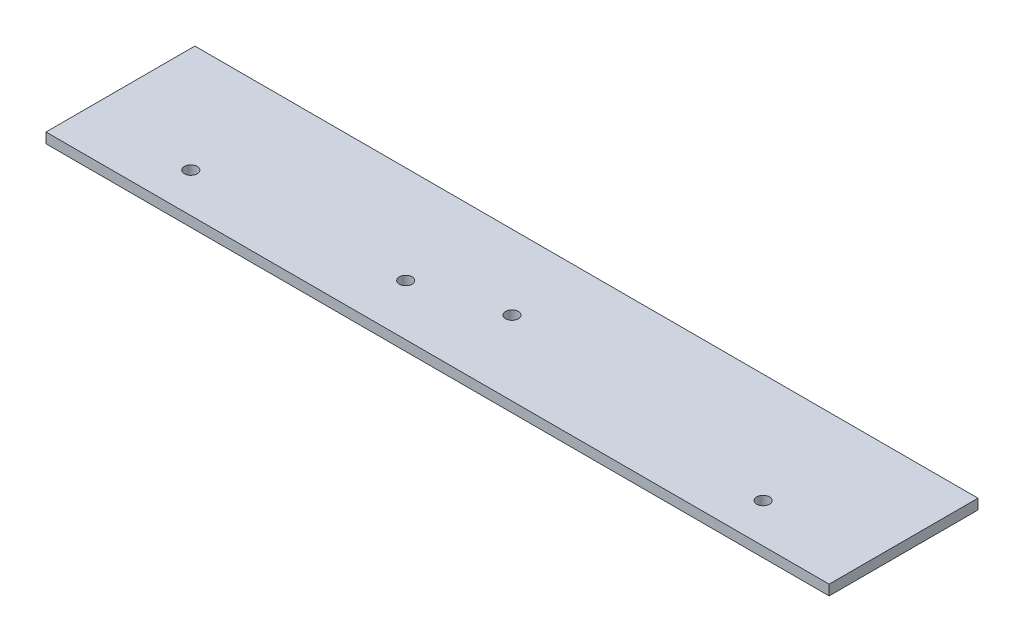
ISO-10303-21;
HEADER;
FILE_DESCRIPTION(('STEP AP214'),'2;1');
FILE_NAME('part.step','',(''),(''),'','','');
FILE_SCHEMA(('AUTOMOTIVE_DESIGN { 1 0 10303 214 1 1 1 1 }'));
ENDSEC;
DATA;
#1=APPLICATION_CONTEXT('core data for automotive mechanical design processes');
#2=APPLICATION_PROTOCOL_DEFINITION('international standard','automotive_design',2000,#1);
#3=PRODUCT_CONTEXT('',#1,'mechanical');
#4=PRODUCT('Part','Part','',(#3));
#5=PRODUCT_RELATED_PRODUCT_CATEGORY('part','',(#4));
#6=PRODUCT_DEFINITION_FORMATION('','',#4);
#7=PRODUCT_DEFINITION_CONTEXT('part definition',#1,'design');
#8=PRODUCT_DEFINITION('design','',#6,#7);
#9=PRODUCT_DEFINITION_SHAPE('','',#8);
#10=(LENGTH_UNIT() NAMED_UNIT(*) SI_UNIT(.MILLI.,.METRE.));
#11=(NAMED_UNIT(*) PLANE_ANGLE_UNIT() SI_UNIT($,.RADIAN.));
#12=(NAMED_UNIT(*) SI_UNIT($,.STERADIAN.) SOLID_ANGLE_UNIT());
#13=UNCERTAINTY_MEASURE_WITH_UNIT(LENGTH_MEASURE(1.E-05),#10,'distance_accuracy_value','');
#14=(GEOMETRIC_REPRESENTATION_CONTEXT(3) GLOBAL_UNCERTAINTY_ASSIGNED_CONTEXT((#13)) GLOBAL_UNIT_ASSIGNED_CONTEXT((#10,
#11,#12)) REPRESENTATION_CONTEXT('',''));
#15=CARTESIAN_POINT('',(0.,0.,0.));
#16=DIRECTION('',(0.,0.,1.));
#17=DIRECTION('',(1.,0.,0.));
#18=AXIS2_PLACEMENT_3D('',#15,#16,#17);
#19=CARTESIAN_POINT('',(0.,1.27,0.));
#20=DIRECTION('',(0.,-1.,0.));
#21=DIRECTION('',(0.,0.,-1.));
#22=AXIS2_PLACEMENT_3D('',#19,#20,#21);
#23=PLANE('',#22);
#24=CARTESIAN_POINT('',(0.,1.27,0.));
#25=DIRECTION('',(0.,1.,0.));
#26=DIRECTION('',(0.,0.,1.));
#27=AXIS2_PLACEMENT_3D('',#24,#25,#26);
#28=CIRCLE('',#27,1.5875);
#29=CARTESIAN_POINT('',(0.,1.27,1.5875));
#30=VERTEX_POINT('',#29);
#31=EDGE_CURVE('E121',#30,#30,#28,.T.);
#32=ORIENTED_EDGE('',*,*,#31,.F.);
#33=EDGE_LOOP('',(#32));
#34=FACE_BOUND('',#33,.T.);
#35=CARTESIAN_POINT('',(-71.,1.27,8.69499999999999));
#36=DIRECTION('',(0.,1.,0.));
#37=DIRECTION('',(0.,0.,1.));
#38=AXIS2_PLACEMENT_3D('',#35,#36,#37);
#39=CIRCLE('',#38,1.58750000000007);
#40=CARTESIAN_POINT('',(-71.,1.27,10.2825000000001));
#41=VERTEX_POINT('',#40);
#42=EDGE_CURVE('E100',#41,#41,#39,.T.);
#43=ORIENTED_EDGE('',*,*,#42,.F.);
#44=EDGE_LOOP('',(#43));
#45=FACE_BOUND('',#44,.T.);
#46=DIRECTION('',(0.,0.,-1.));
#47=VECTOR('',#46,1.);
#48=CARTESIAN_POINT('',(97.1504374582062,1.27,18.4655866878851));
#49=LINE('',#48,#47);
#50=CARTESIAN_POINT('',(97.1504374582062,1.27,18.4655866878851));
#51=VERTEX_POINT('',#50);
#52=CARTESIAN_POINT('',(97.1504374582062,1.27,-18.4655866878852));
#53=VERTEX_POINT('',#52);
#54=EDGE_CURVE('E85',#51,#53,#49,.T.);
#55=ORIENTED_EDGE('',*,*,#54,.T.);
#56=DIRECTION('',(-1.,0.,0.));
#57=VECTOR('',#56,1.);
#58=CARTESIAN_POINT('',(-97.1504374582062,1.27,-18.4655866878852));
#59=LINE('',#58,#57);
#60=CARTESIAN_POINT('',(-97.1504374582062,1.27,-18.4655866878852));
#61=VERTEX_POINT('',#60);
#62=EDGE_CURVE('E80',#53,#61,#59,.T.);
#63=ORIENTED_EDGE('',*,*,#62,.T.);
#64=DIRECTION('',(0.,0.,1.));
#65=VECTOR('',#64,1.);
#66=CARTESIAN_POINT('',(-97.1504374582062,1.27,18.4655866878851));
#67=LINE('',#66,#65);
#68=CARTESIAN_POINT('',(-97.1504374582062,1.27,18.4655866878851));
#69=VERTEX_POINT('',#68);
#70=EDGE_CURVE('E83',#61,#69,#67,.T.);
#71=ORIENTED_EDGE('',*,*,#70,.T.);
#72=DIRECTION('',(1.,0.,0.));
#73=VECTOR('',#72,1.);
#74=CARTESIAN_POINT('',(-97.1504374582062,1.27,18.4655866878851));
#75=LINE('',#74,#73);
#76=EDGE_CURVE('E50',#69,#51,#75,.T.);
#77=ORIENTED_EDGE('',*,*,#76,.T.);
#78=EDGE_LOOP('',(#55,#63,#71,#77));
#79=FACE_BOUND('',#78,.T.);
#80=CARTESIAN_POINT('',(71.,1.27,8.69499999999999));
#81=DIRECTION('',(0.,1.,0.));
#82=DIRECTION('',(0.,0.,1.));
#83=AXIS2_PLACEMENT_3D('',#80,#81,#82);
#84=CIRCLE('',#83,1.5875);
#85=CARTESIAN_POINT('',(71.,1.27,10.2825));
#86=VERTEX_POINT('',#85);
#87=EDGE_CURVE('E115',#86,#86,#84,.T.);
#88=ORIENTED_EDGE('',*,*,#87,.F.);
#89=EDGE_LOOP('',(#88));
#90=FACE_BOUND('',#89,.T.);
#91=CARTESIAN_POINT('',(-20.62,1.27,5.74999999999999));
#92=DIRECTION('',(0.,1.,0.));
#93=DIRECTION('',(0.,0.,1.));
#94=AXIS2_PLACEMENT_3D('',#91,#92,#93);
#95=CIRCLE('',#94,1.5875);
#96=CARTESIAN_POINT('',(-20.62,1.27,7.33749999999999));
#97=VERTEX_POINT('',#96);
#98=EDGE_CURVE('E127',#97,#97,#95,.T.);
#99=ORIENTED_EDGE('',*,*,#98,.F.);
#100=EDGE_LOOP('',(#99));
#101=FACE_BOUND('',#100,.T.);
#102=ADVANCED_FACE('F33',(#34,#45,#79,#90,#101),#23,.F.);
#103=CARTESIAN_POINT('',(0.,-1.27,0.));
#104=DIRECTION('',(0.,-1.,0.));
#105=DIRECTION('',(0.,0.,-1.));
#106=AXIS2_PLACEMENT_3D('',#103,#104,#105);
#107=PLANE('',#106);
#108=CARTESIAN_POINT('',(0.,-1.27,0.));
#109=DIRECTION('',(0.,1.,0.));
#110=DIRECTION('',(0.,0.,1.));
#111=AXIS2_PLACEMENT_3D('',#108,#109,#110);
#112=CIRCLE('',#111,1.5875);
#113=CARTESIAN_POINT('',(0.,-1.27,1.5875));
#114=VERTEX_POINT('',#113);
#115=EDGE_CURVE('E124',#114,#114,#112,.T.);
#116=ORIENTED_EDGE('',*,*,#115,.T.);
#117=EDGE_LOOP('',(#116));
#118=FACE_BOUND('',#117,.T.);
#119=CARTESIAN_POINT('',(-71.,-1.27,8.69499999999999));
#120=DIRECTION('',(0.,1.,0.));
#121=DIRECTION('',(0.,0.,1.));
#122=AXIS2_PLACEMENT_3D('',#119,#120,#121);
#123=CIRCLE('',#122,1.58750000000007);
#124=CARTESIAN_POINT('',(-71.,-1.27,10.2825000000001));
#125=VERTEX_POINT('',#124);
#126=EDGE_CURVE('E112',#125,#125,#123,.T.);
#127=ORIENTED_EDGE('',*,*,#126,.T.);
#128=EDGE_LOOP('',(#127));
#129=FACE_BOUND('',#128,.T.);
#130=DIRECTION('',(0.,0.,-1.));
#131=VECTOR('',#130,1.);
#132=CARTESIAN_POINT('',(97.1504374582062,-1.27,18.4655866878851));
#133=LINE('',#132,#131);
#134=CARTESIAN_POINT('',(97.1504374582062,-1.27,18.4655866878851));
#135=VERTEX_POINT('',#134);
#136=CARTESIAN_POINT('',(97.1504374582062,-1.27,-18.4655866878852));
#137=VERTEX_POINT('',#136);
#138=EDGE_CURVE('E97',#135,#137,#133,.T.);
#139=ORIENTED_EDGE('',*,*,#138,.F.);
#140=DIRECTION('',(1.,0.,0.));
#141=VECTOR('',#140,1.);
#142=CARTESIAN_POINT('',(-97.1504374582062,-1.27,18.4655866878851));
#143=LINE('',#142,#141);
#144=CARTESIAN_POINT('',(-97.1504374582062,-1.27,18.4655866878851));
#145=VERTEX_POINT('',#144);
#146=EDGE_CURVE('E73',#145,#135,#143,.T.);
#147=ORIENTED_EDGE('',*,*,#146,.F.);
#148=DIRECTION('',(0.,0.,1.));
#149=VECTOR('',#148,1.);
#150=CARTESIAN_POINT('',(-97.1504374582062,-1.27,18.4655866878851));
#151=LINE('',#150,#149);
#152=CARTESIAN_POINT('',(-97.1504374582062,-1.27,-18.4655866878852));
#153=VERTEX_POINT('',#152);
#154=EDGE_CURVE('E67',#153,#145,#151,.T.);
#155=ORIENTED_EDGE('',*,*,#154,.F.);
#156=DIRECTION('',(-1.,0.,0.));
#157=VECTOR('',#156,1.);
#158=CARTESIAN_POINT('',(-97.1504374582062,-1.27,-18.4655866878852));
#159=LINE('',#158,#157);
#160=EDGE_CURVE('E89',#137,#153,#159,.T.);
#161=ORIENTED_EDGE('',*,*,#160,.F.);
#162=EDGE_LOOP('',(#139,#147,#155,#161));
#163=FACE_BOUND('',#162,.T.);
#164=CARTESIAN_POINT('',(71.,-1.27,8.69499999999999));
#165=DIRECTION('',(0.,1.,0.));
#166=DIRECTION('',(0.,0.,1.));
#167=AXIS2_PLACEMENT_3D('',#164,#165,#166);
#168=CIRCLE('',#167,1.5875);
#169=CARTESIAN_POINT('',(71.,-1.27,10.2825));
#170=VERTEX_POINT('',#169);
#171=EDGE_CURVE('E118',#170,#170,#168,.T.);
#172=ORIENTED_EDGE('',*,*,#171,.T.);
#173=EDGE_LOOP('',(#172));
#174=FACE_BOUND('',#173,.T.);
#175=CARTESIAN_POINT('',(-20.62,-1.27,5.74999999999999));
#176=DIRECTION('',(0.,1.,0.));
#177=DIRECTION('',(0.,0.,1.));
#178=AXIS2_PLACEMENT_3D('',#175,#176,#177);
#179=CIRCLE('',#178,1.5875);
#180=CARTESIAN_POINT('',(-20.62,-1.27,7.33749999999999));
#181=VERTEX_POINT('',#180);
#182=EDGE_CURVE('E130',#181,#181,#179,.T.);
#183=ORIENTED_EDGE('',*,*,#182,.T.);
#184=EDGE_LOOP('',(#183));
#185=FACE_BOUND('',#184,.T.);
#186=ADVANCED_FACE('F108',(#118,#129,#163,#174,#185),#107,.T.);
#187=CARTESIAN_POINT('',(97.1504374582062,1.27,18.4655866878851));
#188=DIRECTION('',(-1.,0.,0.));
#189=DIRECTION('',(0.,0.,1.));
#190=AXIS2_PLACEMENT_3D('',#187,#188,#189);
#191=PLANE('',#190);
#192=ORIENTED_EDGE('',*,*,#138,.T.);
#193=DIRECTION('',(0.,-1.,0.));
#194=VECTOR('',#193,1.);
#195=CARTESIAN_POINT('',(97.1504374582062,1.27,-18.4655866878852));
#196=LINE('',#195,#194);
#197=EDGE_CURVE('E11',#53,#137,#196,.T.);
#198=ORIENTED_EDGE('',*,*,#197,.F.);
#199=ORIENTED_EDGE('',*,*,#54,.F.);
#200=DIRECTION('',(0.,-1.,0.));
#201=VECTOR('',#200,1.);
#202=CARTESIAN_POINT('',(97.1504374582062,1.27,18.4655866878851));
#203=LINE('',#202,#201);
#204=EDGE_CURVE('E93',#51,#135,#203,.T.);
#205=ORIENTED_EDGE('',*,*,#204,.T.);
#206=EDGE_LOOP('',(#192,#198,#199,#205));
#207=FACE_BOUND('',#206,.T.);
#208=ADVANCED_FACE('F35',(#207),#191,.F.);
#209=CARTESIAN_POINT('',(-97.1504374582062,1.27,-18.4655866878852));
#210=DIRECTION('',(0.,0.,1.));
#211=DIRECTION('',(1.,0.,0.));
#212=AXIS2_PLACEMENT_3D('',#209,#210,#211);
#213=PLANE('',#212);
#214=ORIENTED_EDGE('',*,*,#160,.T.);
#215=DIRECTION('',(0.,-1.,0.));
#216=VECTOR('',#215,1.);
#217=CARTESIAN_POINT('',(-97.1504374582062,1.27,-18.4655866878852));
#218=LINE('',#217,#216);
#219=EDGE_CURVE('E42',#61,#153,#218,.T.);
#220=ORIENTED_EDGE('',*,*,#219,.F.);
#221=ORIENTED_EDGE('',*,*,#62,.F.);
#222=ORIENTED_EDGE('',*,*,#197,.T.);
#223=EDGE_LOOP('',(#214,#220,#221,#222));
#224=FACE_BOUND('',#223,.T.);
#225=ADVANCED_FACE('F88',(#224),#213,.F.);
#226=CARTESIAN_POINT('',(-97.1504374582062,1.27,18.4655866878851));
#227=DIRECTION('',(1.,0.,0.));
#228=DIRECTION('',(0.,0.,-1.));
#229=AXIS2_PLACEMENT_3D('',#226,#227,#228);
#230=PLANE('',#229);
#231=ORIENTED_EDGE('',*,*,#154,.T.);
#232=DIRECTION('',(0.,-1.,0.));
#233=VECTOR('',#232,1.);
#234=CARTESIAN_POINT('',(-97.1504374582062,1.27,18.4655866878851));
#235=LINE('',#234,#233);
#236=EDGE_CURVE('E90',#69,#145,#235,.T.);
#237=ORIENTED_EDGE('',*,*,#236,.F.);
#238=ORIENTED_EDGE('',*,*,#70,.F.);
#239=ORIENTED_EDGE('',*,*,#219,.T.);
#240=EDGE_LOOP('',(#231,#237,#238,#239));
#241=FACE_BOUND('',#240,.T.);
#242=ADVANCED_FACE('F91',(#241),#230,.F.);
#243=CARTESIAN_POINT('',(-97.1504374582062,1.27,18.4655866878851));
#244=DIRECTION('',(0.,0.,-1.));
#245=DIRECTION('',(-1.,0.,0.));
#246=AXIS2_PLACEMENT_3D('',#243,#244,#245);
#247=PLANE('',#246);
#248=ORIENTED_EDGE('',*,*,#146,.T.);
#249=ORIENTED_EDGE('',*,*,#204,.F.);
#250=ORIENTED_EDGE('',*,*,#76,.F.);
#251=ORIENTED_EDGE('',*,*,#236,.T.);
#252=EDGE_LOOP('',(#248,#249,#250,#251));
#253=FACE_BOUND('',#252,.T.);
#254=ADVANCED_FACE('F105',(#253),#247,.F.);
#255=CARTESIAN_POINT('',(-71.,1.27,8.69499999999999));
#256=DIRECTION('',(0.,-1.,0.));
#257=DIRECTION('',(0.,0.,-1.));
#258=AXIS2_PLACEMENT_3D('',#255,#256,#257);
#259=CYLINDRICAL_SURFACE('',#258,1.58750000000007);
#260=ORIENTED_EDGE('',*,*,#42,.T.);
#261=EDGE_LOOP('',(#260));
#262=FACE_BOUND('',#261,.T.);
#263=ORIENTED_EDGE('',*,*,#126,.F.);
#264=EDGE_LOOP('',(#263));
#265=FACE_BOUND('',#264,.T.);
#266=ADVANCED_FACE('F150',(#262,#265),#259,.F.);
#267=CARTESIAN_POINT('',(71.,1.27,8.69499999999999));
#268=DIRECTION('',(0.,-1.,0.));
#269=DIRECTION('',(0.,0.,-1.));
#270=AXIS2_PLACEMENT_3D('',#267,#268,#269);
#271=CYLINDRICAL_SURFACE('',#270,1.5875);
#272=ORIENTED_EDGE('',*,*,#87,.T.);
#273=EDGE_LOOP('',(#272));
#274=FACE_BOUND('',#273,.T.);
#275=ORIENTED_EDGE('',*,*,#171,.F.);
#276=EDGE_LOOP('',(#275));
#277=FACE_BOUND('',#276,.T.);
#278=ADVANCED_FACE('F196',(#274,#277),#271,.F.);
#279=CARTESIAN_POINT('',(0.,1.27,0.));
#280=DIRECTION('',(0.,-1.,0.));
#281=DIRECTION('',(0.,0.,-1.));
#282=AXIS2_PLACEMENT_3D('',#279,#280,#281);
#283=CYLINDRICAL_SURFACE('',#282,1.5875);
#284=ORIENTED_EDGE('',*,*,#31,.T.);
#285=EDGE_LOOP('',(#284));
#286=FACE_BOUND('',#285,.T.);
#287=ORIENTED_EDGE('',*,*,#115,.F.);
#288=EDGE_LOOP('',(#287));
#289=FACE_BOUND('',#288,.T.);
#290=ADVANCED_FACE('F204',(#286,#289),#283,.F.);
#291=CARTESIAN_POINT('',(-20.62,1.27,5.74999999999999));
#292=DIRECTION('',(0.,-1.,0.));
#293=DIRECTION('',(0.,0.,-1.));
#294=AXIS2_PLACEMENT_3D('',#291,#292,#293);
#295=CYLINDRICAL_SURFACE('',#294,1.5875);
#296=ORIENTED_EDGE('',*,*,#98,.T.);
#297=EDGE_LOOP('',(#296));
#298=FACE_BOUND('',#297,.T.);
#299=ORIENTED_EDGE('',*,*,#182,.F.);
#300=EDGE_LOOP('',(#299));
#301=FACE_BOUND('',#300,.T.);
#302=ADVANCED_FACE('F136',(#298,#301),#295,.F.);
#303=CLOSED_SHELL('',(#102,#186,#208,#225,#242,#254,#266,#278,#290,#302));
#304=MANIFOLD_SOLID_BREP('B2',#303);
#305=ADVANCED_BREP_SHAPE_REPRESENTATION('',(#18,#304),#14);
#306=SHAPE_DEFINITION_REPRESENTATION(#9,#305);
ENDSEC;
END-ISO-10303-21;
